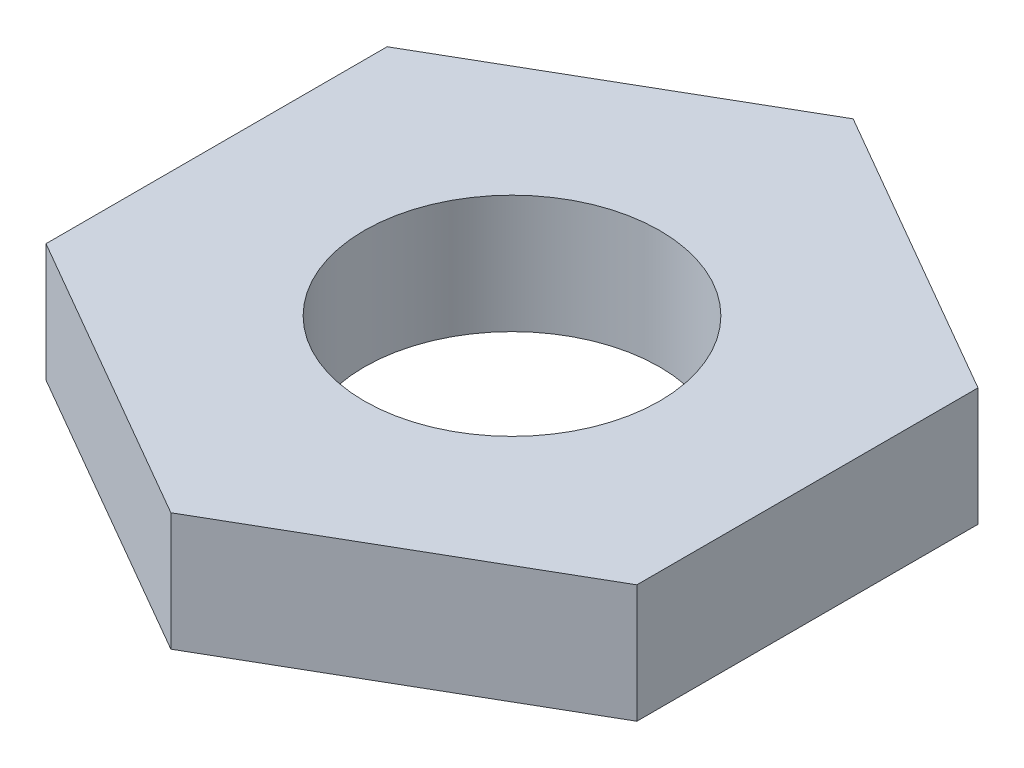
ISO-10303-21;
HEADER;
FILE_DESCRIPTION(('STEP AP214'),'2;1');
FILE_NAME('part.step','',(''),(''),'','','');
FILE_SCHEMA(('AUTOMOTIVE_DESIGN { 1 0 10303 214 1 1 1 1 }'));
ENDSEC;
DATA;
#1=APPLICATION_CONTEXT('core data for automotive mechanical design processes');
#2=APPLICATION_PROTOCOL_DEFINITION('international standard','automotive_design',2000,#1);
#3=PRODUCT_CONTEXT('',#1,'mechanical');
#4=PRODUCT('Part','Part','',(#3));
#5=PRODUCT_RELATED_PRODUCT_CATEGORY('part','',(#4));
#6=PRODUCT_DEFINITION_FORMATION('','',#4);
#7=PRODUCT_DEFINITION_CONTEXT('part definition',#1,'design');
#8=PRODUCT_DEFINITION('design','',#6,#7);
#9=PRODUCT_DEFINITION_SHAPE('','',#8);
#10=(LENGTH_UNIT() NAMED_UNIT(*) SI_UNIT(.MILLI.,.METRE.));
#11=(NAMED_UNIT(*) PLANE_ANGLE_UNIT() SI_UNIT($,.RADIAN.));
#12=(NAMED_UNIT(*) SI_UNIT($,.STERADIAN.) SOLID_ANGLE_UNIT());
#13=UNCERTAINTY_MEASURE_WITH_UNIT(LENGTH_MEASURE(1.E-05),#10,'distance_accuracy_value','');
#14=(GEOMETRIC_REPRESENTATION_CONTEXT(3) GLOBAL_UNCERTAINTY_ASSIGNED_CONTEXT((#13)) GLOBAL_UNIT_ASSIGNED_CONTEXT((#10,
#11,#12)) REPRESENTATION_CONTEXT('',''));
#15=CARTESIAN_POINT('',(0.,0.,0.));
#16=DIRECTION('',(0.,0.,1.));
#17=DIRECTION('',(1.,0.,0.));
#18=AXIS2_PLACEMENT_3D('',#15,#16,#17);
#19=CARTESIAN_POINT('',(0.,2.54,0.));
#20=DIRECTION('',(0.,1.,0.));
#21=DIRECTION('',(0.,0.,1.));
#22=AXIS2_PLACEMENT_3D('',#19,#20,#21);
#23=PLANE('',#22);
#24=DIRECTION('',(-0.866025403784441,0.,-0.499999999999995));
#25=VECTOR('',#24,1.);
#26=CARTESIAN_POINT('',(6.34999999999995,2.54,-3.66617420935419));
#27=LINE('',#26,#25);
#28=CARTESIAN_POINT('',(6.34999999999995,2.54,-3.66617420935419));
#29=VERTEX_POINT('',#28);
#30=CARTESIAN_POINT('',(0.,2.54,-7.33234841870824));
#31=VERTEX_POINT('',#30);
#32=EDGE_CURVE('E131',#29,#31,#27,.T.);
#33=ORIENTED_EDGE('',*,*,#32,.T.);
#34=DIRECTION('',(-0.866025403784438,0.,0.500000000000001));
#35=VECTOR('',#34,1.);
#36=CARTESIAN_POINT('',(0.,2.54,-7.33234841870824));
#37=LINE('',#36,#35);
#38=CARTESIAN_POINT('',(-6.35,2.54,-3.6661742093541));
#39=VERTEX_POINT('',#38);
#40=EDGE_CURVE('E89',#31,#39,#37,.T.);
#41=ORIENTED_EDGE('',*,*,#40,.T.);
#42=DIRECTION('',(0.,0.,1.));
#43=VECTOR('',#42,1.);
#44=CARTESIAN_POINT('',(-6.35,2.54,-3.6661742093541));
#45=LINE('',#44,#43);
#46=CARTESIAN_POINT('',(-6.34999999999997,2.54,3.66617420935415));
#47=VERTEX_POINT('',#46);
#48=EDGE_CURVE('E102',#39,#47,#45,.T.);
#49=ORIENTED_EDGE('',*,*,#48,.T.);
#50=DIRECTION('',(0.866025403784441,0.,0.499999999999995));
#51=VECTOR('',#50,1.);
#52=CARTESIAN_POINT('',(-6.34999999999997,2.54,3.66617420935415));
#53=LINE('',#52,#51);
#54=CARTESIAN_POINT('',(0.,2.54,7.33234841870824));
#55=VERTEX_POINT('',#54);
#56=EDGE_CURVE('E96',#47,#55,#53,.T.);
#57=ORIENTED_EDGE('',*,*,#56,.T.);
#58=DIRECTION('',(0.866025403784435,0.,-0.500000000000007));
#59=VECTOR('',#58,1.);
#60=CARTESIAN_POINT('',(0.,2.54,7.33234841870824));
#61=LINE('',#60,#59);
#62=CARTESIAN_POINT('',(6.35000000000002,2.54,3.66617420935406));
#63=VERTEX_POINT('',#62);
#64=EDGE_CURVE('E100',#55,#63,#61,.T.);
#65=ORIENTED_EDGE('',*,*,#64,.T.);
#66=DIRECTION('',(0.,0.,-1.));
#67=VECTOR('',#66,1.);
#68=CARTESIAN_POINT('',(6.35000000000002,2.54,3.66617420935406));
#69=LINE('',#68,#67);
#70=EDGE_CURVE('E52',#63,#29,#69,.T.);
#71=ORIENTED_EDGE('',*,*,#70,.T.);
#72=EDGE_LOOP('',(#33,#41,#49,#57,#65,#71));
#73=FACE_BOUND('',#72,.T.);
#74=CARTESIAN_POINT('',(0.,2.54,0.));
#75=DIRECTION('',(0.,1.,0.));
#76=DIRECTION('',(0.,0.,1.));
#77=AXIS2_PLACEMENT_3D('',#74,#75,#76);
#78=CIRCLE('',#77,3.175);
#79=CARTESIAN_POINT('',(0.,2.54,3.175));
#80=VERTEX_POINT('',#79);
#81=EDGE_CURVE('E124',#80,#80,#78,.T.);
#82=ORIENTED_EDGE('',*,*,#81,.F.);
#83=EDGE_LOOP('',(#82));
#84=FACE_BOUND('',#83,.T.);
#85=ADVANCED_FACE('F35',(#73,#84),#23,.T.);
#86=CARTESIAN_POINT('',(0.,0.,0.));
#87=DIRECTION('',(0.,1.,0.));
#88=DIRECTION('',(0.,0.,1.));
#89=AXIS2_PLACEMENT_3D('',#86,#87,#88);
#90=PLANE('',#89);
#91=DIRECTION('',(-0.866025403784441,0.,-0.499999999999995));
#92=VECTOR('',#91,1.);
#93=CARTESIAN_POINT('',(6.34999999999995,0.,-3.66617420935419));
#94=LINE('',#93,#92);
#95=CARTESIAN_POINT('',(6.34999999999995,0.,-3.66617420935419));
#96=VERTEX_POINT('',#95);
#97=CARTESIAN_POINT('',(0.,0.,-7.33234841870824));
#98=VERTEX_POINT('',#97);
#99=EDGE_CURVE('E120',#96,#98,#94,.T.);
#100=ORIENTED_EDGE('',*,*,#99,.F.);
#101=DIRECTION('',(0.,0.,-1.));
#102=VECTOR('',#101,1.);
#103=CARTESIAN_POINT('',(6.35000000000002,0.,3.66617420935406));
#104=LINE('',#103,#102);
#105=CARTESIAN_POINT('',(6.35000000000002,0.,3.66617420935406));
#106=VERTEX_POINT('',#105);
#107=EDGE_CURVE('E81',#106,#96,#104,.T.);
#108=ORIENTED_EDGE('',*,*,#107,.F.);
#109=DIRECTION('',(0.866025403784435,0.,-0.500000000000007));
#110=VECTOR('',#109,1.);
#111=CARTESIAN_POINT('',(0.,0.,7.33234841870824));
#112=LINE('',#111,#110);
#113=CARTESIAN_POINT('',(0.,0.,7.33234841870824));
#114=VERTEX_POINT('',#113);
#115=EDGE_CURVE('E75',#114,#106,#112,.T.);
#116=ORIENTED_EDGE('',*,*,#115,.F.);
#117=DIRECTION('',(0.866025403784441,0.,0.499999999999995));
#118=VECTOR('',#117,1.);
#119=CARTESIAN_POINT('',(-6.34999999999997,0.,3.66617420935415));
#120=LINE('',#119,#118);
#121=CARTESIAN_POINT('',(-6.34999999999997,0.,3.66617420935415));
#122=VERTEX_POINT('',#121);
#123=EDGE_CURVE('E110',#122,#114,#120,.T.);
#124=ORIENTED_EDGE('',*,*,#123,.F.);
#125=DIRECTION('',(0.,0.,1.));
#126=VECTOR('',#125,1.);
#127=CARTESIAN_POINT('',(-6.35,0.,-3.6661742093541));
#128=LINE('',#127,#126);
#129=CARTESIAN_POINT('',(-6.35,0.,-3.6661742093541));
#130=VERTEX_POINT('',#129);
#131=EDGE_CURVE('E126',#130,#122,#128,.T.);
#132=ORIENTED_EDGE('',*,*,#131,.F.);
#133=DIRECTION('',(-0.866025403784438,0.,0.500000000000001));
#134=VECTOR('',#133,1.);
#135=CARTESIAN_POINT('',(0.,0.,-7.33234841870824));
#136=LINE('',#135,#134);
#137=EDGE_CURVE('E123',#98,#130,#136,.T.);
#138=ORIENTED_EDGE('',*,*,#137,.F.);
#139=EDGE_LOOP('',(#100,#108,#116,#124,#132,#138));
#140=FACE_BOUND('',#139,.T.);
#141=CARTESIAN_POINT('',(0.,0.,0.));
#142=DIRECTION('',(0.,1.,0.));
#143=DIRECTION('',(0.,0.,1.));
#144=AXIS2_PLACEMENT_3D('',#141,#142,#143);
#145=CIRCLE('',#144,3.175);
#146=CARTESIAN_POINT('',(0.,0.,3.175));
#147=VERTEX_POINT('',#146);
#148=EDGE_CURVE('E224',#147,#147,#145,.T.);
#149=ORIENTED_EDGE('',*,*,#148,.T.);
#150=EDGE_LOOP('',(#149));
#151=FACE_BOUND('',#150,.T.);
#152=ADVANCED_FACE('F140',(#140,#151),#90,.F.);
#153=CARTESIAN_POINT('',(6.34999999999995,2.54,-3.66617420935419));
#154=DIRECTION('',(-0.499999999999995,0.,0.866025403784441));
#155=DIRECTION('',(0.866025403784442,0.,0.499999999999995));
#156=AXIS2_PLACEMENT_3D('',#153,#154,#155);
#157=PLANE('',#156);
#158=ORIENTED_EDGE('',*,*,#99,.T.);
#159=DIRECTION('',(0.,-1.,0.));
#160=VECTOR('',#159,1.);
#161=CARTESIAN_POINT('',(0.,2.54,-7.33234841870824));
#162=LINE('',#161,#160);
#163=EDGE_CURVE('E11',#31,#98,#162,.T.);
#164=ORIENTED_EDGE('',*,*,#163,.F.);
#165=ORIENTED_EDGE('',*,*,#32,.F.);
#166=DIRECTION('',(0.,-1.,0.));
#167=VECTOR('',#166,1.);
#168=CARTESIAN_POINT('',(6.34999999999995,2.54,-3.66617420935419));
#169=LINE('',#168,#167);
#170=EDGE_CURVE('E116',#29,#96,#169,.T.);
#171=ORIENTED_EDGE('',*,*,#170,.T.);
#172=EDGE_LOOP('',(#158,#164,#165,#171));
#173=FACE_BOUND('',#172,.T.);
#174=ADVANCED_FACE('F37',(#173),#157,.F.);
#175=CARTESIAN_POINT('',(0.,2.54,-7.33234841870824));
#176=DIRECTION('',(0.500000000000001,0.,0.866025403784438));
#177=DIRECTION('',(0.866025403784438,0.,-0.500000000000001));
#178=AXIS2_PLACEMENT_3D('',#175,#176,#177);
#179=PLANE('',#178);
#180=ORIENTED_EDGE('',*,*,#137,.T.);
#181=DIRECTION('',(0.,-1.,0.));
#182=VECTOR('',#181,1.);
#183=CARTESIAN_POINT('',(-6.35,2.54,-3.6661742093541));
#184=LINE('',#183,#182);
#185=EDGE_CURVE('E44',#39,#130,#184,.T.);
#186=ORIENTED_EDGE('',*,*,#185,.F.);
#187=ORIENTED_EDGE('',*,*,#40,.F.);
#188=ORIENTED_EDGE('',*,*,#163,.T.);
#189=EDGE_LOOP('',(#180,#186,#187,#188));
#190=FACE_BOUND('',#189,.T.);
#191=ADVANCED_FACE('F165',(#190),#179,.F.);
#192=CARTESIAN_POINT('',(-6.35,2.54,-3.6661742093541));
#193=DIRECTION('',(1.,0.,0.));
#194=DIRECTION('',(0.,0.,-1.));
#195=AXIS2_PLACEMENT_3D('',#192,#193,#194);
#196=PLANE('',#195);
#197=ORIENTED_EDGE('',*,*,#131,.T.);
#198=DIRECTION('',(0.,-1.,0.));
#199=VECTOR('',#198,1.);
#200=CARTESIAN_POINT('',(-6.34999999999997,2.54,3.66617420935415));
#201=LINE('',#200,#199);
#202=EDGE_CURVE('E111',#47,#122,#201,.T.);
#203=ORIENTED_EDGE('',*,*,#202,.F.);
#204=ORIENTED_EDGE('',*,*,#48,.F.);
#205=ORIENTED_EDGE('',*,*,#185,.T.);
#206=EDGE_LOOP('',(#197,#203,#204,#205));
#207=FACE_BOUND('',#206,.T.);
#208=ADVANCED_FACE('F137',(#207),#196,.F.);
#209=CARTESIAN_POINT('',(-6.34999999999997,2.54,3.66617420935415));
#210=DIRECTION('',(0.499999999999995,0.,-0.866025403784442));
#211=DIRECTION('',(-0.866025403784442,0.,-0.499999999999995));
#212=AXIS2_PLACEMENT_3D('',#209,#210,#211);
#213=PLANE('',#212);
#214=ORIENTED_EDGE('',*,*,#123,.T.);
#215=DIRECTION('',(0.,-1.,0.));
#216=VECTOR('',#215,1.);
#217=CARTESIAN_POINT('',(0.,2.54,7.33234841870824));
#218=LINE('',#217,#216);
#219=EDGE_CURVE('E107',#55,#114,#218,.T.);
#220=ORIENTED_EDGE('',*,*,#219,.F.);
#221=ORIENTED_EDGE('',*,*,#56,.F.);
#222=ORIENTED_EDGE('',*,*,#202,.T.);
#223=EDGE_LOOP('',(#214,#220,#221,#222));
#224=FACE_BOUND('',#223,.T.);
#225=ADVANCED_FACE('F108',(#224),#213,.F.);
#226=CARTESIAN_POINT('',(0.,2.54,7.33234841870824));
#227=DIRECTION('',(-0.500000000000007,0.,-0.866025403784434));
#228=DIRECTION('',(-0.866025403784435,0.,0.500000000000007));
#229=AXIS2_PLACEMENT_3D('',#226,#227,#228);
#230=PLANE('',#229);
#231=ORIENTED_EDGE('',*,*,#115,.T.);
#232=DIRECTION('',(0.,-1.,0.));
#233=VECTOR('',#232,1.);
#234=CARTESIAN_POINT('',(6.35000000000002,2.54,3.66617420935406));
#235=LINE('',#234,#233);
#236=EDGE_CURVE('E112',#63,#106,#235,.T.);
#237=ORIENTED_EDGE('',*,*,#236,.F.);
#238=ORIENTED_EDGE('',*,*,#64,.F.);
#239=ORIENTED_EDGE('',*,*,#219,.T.);
#240=EDGE_LOOP('',(#231,#237,#238,#239));
#241=FACE_BOUND('',#240,.T.);
#242=ADVANCED_FACE('F114',(#241),#230,.F.);
#243=CARTESIAN_POINT('',(6.35000000000002,2.54,3.66617420935406));
#244=DIRECTION('',(-1.,0.,0.));
#245=DIRECTION('',(0.,0.,1.));
#246=AXIS2_PLACEMENT_3D('',#243,#244,#245);
#247=PLANE('',#246);
#248=ORIENTED_EDGE('',*,*,#107,.T.);
#249=ORIENTED_EDGE('',*,*,#170,.F.);
#250=ORIENTED_EDGE('',*,*,#70,.F.);
#251=ORIENTED_EDGE('',*,*,#236,.T.);
#252=EDGE_LOOP('',(#248,#249,#250,#251));
#253=FACE_BOUND('',#252,.T.);
#254=ADVANCED_FACE('F145',(#253),#247,.F.);
#255=CARTESIAN_POINT('',(0.,2.54,0.));
#256=DIRECTION('',(0.,-1.,0.));
#257=DIRECTION('',(0.,0.,-1.));
#258=AXIS2_PLACEMENT_3D('',#255,#256,#257);
#259=CYLINDRICAL_SURFACE('',#258,3.175);
#260=ORIENTED_EDGE('',*,*,#81,.T.);
#261=EDGE_LOOP('',(#260));
#262=FACE_BOUND('',#261,.T.);
#263=ORIENTED_EDGE('',*,*,#148,.F.);
#264=EDGE_LOOP('',(#263));
#265=FACE_BOUND('',#264,.T.);
#266=ADVANCED_FACE('F147',(#262,#265),#259,.F.);
#267=CLOSED_SHELL('',(#85,#152,#174,#191,#208,#225,#242,#254,#266));
#268=MANIFOLD_SOLID_BREP('B2',#267);
#269=ADVANCED_BREP_SHAPE_REPRESENTATION('',(#18,#268),#14);
#270=SHAPE_DEFINITION_REPRESENTATION(#9,#269);
ENDSEC;
END-ISO-10303-21;
